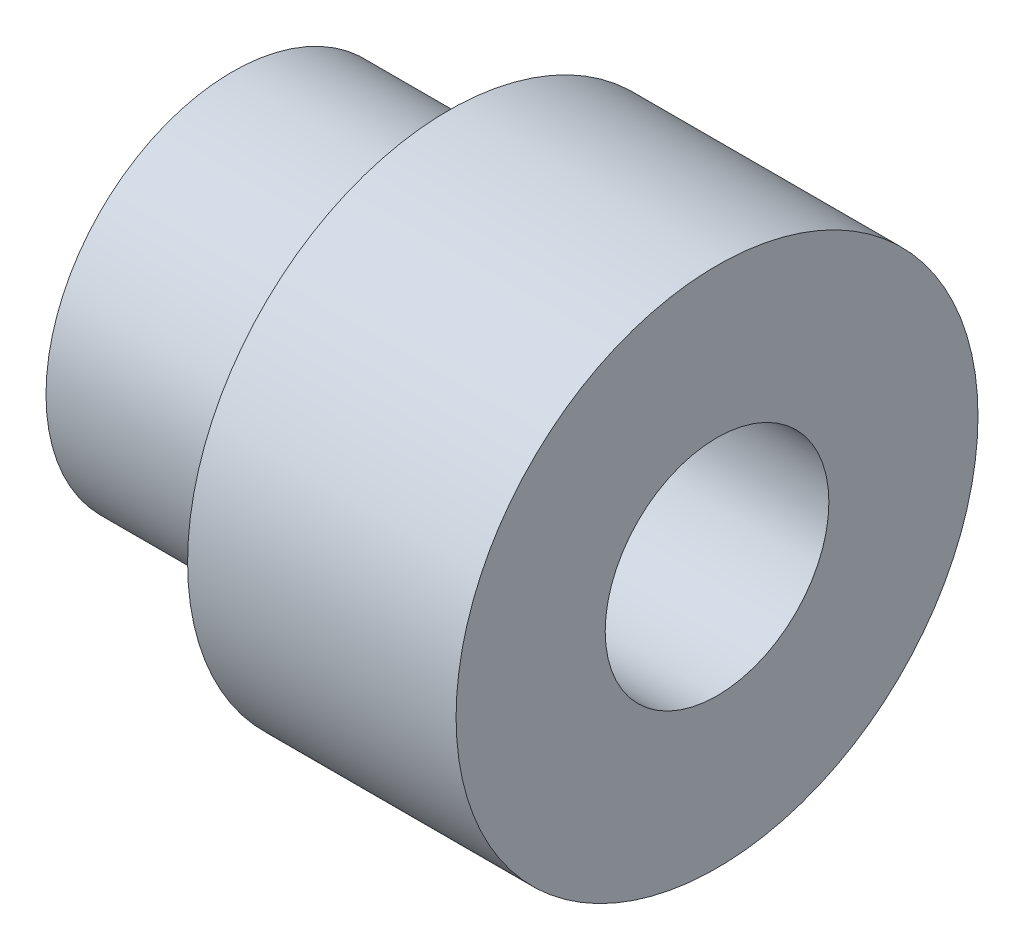
ISO-10303-21;
HEADER;
FILE_DESCRIPTION(('STEP AP214'),'2;1');
FILE_NAME('part.step','',(''),(''),'','','');
FILE_SCHEMA(('AUTOMOTIVE_DESIGN { 1 0 10303 214 1 1 1 1 }'));
ENDSEC;
DATA;
#1=APPLICATION_CONTEXT('core data for automotive mechanical design processes');
#2=APPLICATION_PROTOCOL_DEFINITION('international standard','automotive_design',2000,#1);
#3=PRODUCT_CONTEXT('',#1,'mechanical');
#4=PRODUCT('Part','Part','',(#3));
#5=PRODUCT_RELATED_PRODUCT_CATEGORY('part','',(#4));
#6=PRODUCT_DEFINITION_FORMATION('','',#4);
#7=PRODUCT_DEFINITION_CONTEXT('part definition',#1,'design');
#8=PRODUCT_DEFINITION('design','',#6,#7);
#9=PRODUCT_DEFINITION_SHAPE('','',#8);
#10=(LENGTH_UNIT() NAMED_UNIT(*) SI_UNIT(.MILLI.,.METRE.));
#11=(NAMED_UNIT(*) PLANE_ANGLE_UNIT() SI_UNIT($,.RADIAN.));
#12=(NAMED_UNIT(*) SI_UNIT($,.STERADIAN.) SOLID_ANGLE_UNIT());
#13=UNCERTAINTY_MEASURE_WITH_UNIT(LENGTH_MEASURE(1.E-05),#10,'distance_accuracy_value','');
#14=(GEOMETRIC_REPRESENTATION_CONTEXT(3) GLOBAL_UNCERTAINTY_ASSIGNED_CONTEXT((#13)) GLOBAL_UNIT_ASSIGNED_CONTEXT((#10,
#11,#12)) REPRESENTATION_CONTEXT('',''));
#15=CARTESIAN_POINT('',(0.,0.,0.));
#16=DIRECTION('',(0.,0.,1.));
#17=DIRECTION('',(1.,0.,0.));
#18=AXIS2_PLACEMENT_3D('',#15,#16,#17);
#19=CARTESIAN_POINT('',(0.,0.,0.));
#20=DIRECTION('',(1.,0.,0.));
#21=DIRECTION('',(0.,0.,-1.));
#22=AXIS2_PLACEMENT_3D('',#19,#20,#21);
#23=PLANE('',#22);
#24=CARTESIAN_POINT('',(0.,0.,0.));
#25=DIRECTION('',(1.,0.,0.));
#26=DIRECTION('',(0.,0.,-1.));
#27=AXIS2_PLACEMENT_3D('',#24,#25,#26);
#28=CIRCLE('',#27,3.);
#29=CARTESIAN_POINT('',(0.,0.,3.));
#30=VERTEX_POINT('',#29);
#31=EDGE_CURVE('E63',#30,#30,#28,.T.);
#32=ORIENTED_EDGE('',*,*,#31,.T.);
#33=EDGE_LOOP('',(#32));
#34=FACE_BOUND('',#33,.T.);
#35=CARTESIAN_POINT('',(0.,0.,0.));
#36=DIRECTION('',(-1.,0.,0.));
#37=DIRECTION('',(0.,0.,1.));
#38=AXIS2_PLACEMENT_3D('',#35,#36,#37);
#39=CIRCLE('',#38,5.);
#40=CARTESIAN_POINT('',(0.,0.,5.));
#41=VERTEX_POINT('',#40);
#42=EDGE_CURVE('E10',#41,#41,#39,.T.);
#43=ORIENTED_EDGE('',*,*,#42,.T.);
#44=EDGE_LOOP('',(#43));
#45=FACE_BOUND('',#44,.T.);
#46=ADVANCED_FACE('F39',(#34,#45),#23,.F.);
#47=CARTESIAN_POINT('',(0.,0.,0.));
#48=DIRECTION('',(-1.,0.,0.));
#49=DIRECTION('',(0.,0.,1.));
#50=AXIS2_PLACEMENT_3D('',#47,#48,#49);
#51=CYLINDRICAL_SURFACE('',#50,5.);
#52=ORIENTED_EDGE('',*,*,#42,.F.);
#53=EDGE_LOOP('',(#52));
#54=FACE_BOUND('',#53,.T.);
#55=CARTESIAN_POINT('',(5.79770114942529,0.,0.));
#56=DIRECTION('',(-1.,0.,0.));
#57=DIRECTION('',(0.,0.,1.));
#58=AXIS2_PLACEMENT_3D('',#55,#56,#57);
#59=CIRCLE('',#58,5.);
#60=CARTESIAN_POINT('',(5.79770114942529,0.,5.));
#61=VERTEX_POINT('',#60);
#62=EDGE_CURVE('E46',#61,#61,#59,.T.);
#63=ORIENTED_EDGE('',*,*,#62,.T.);
#64=EDGE_LOOP('',(#63));
#65=FACE_BOUND('',#64,.T.);
#66=ADVANCED_FACE('F88',(#54,#65),#51,.T.);
#67=CARTESIAN_POINT('',(5.79770114942529,5.,0.));
#68=DIRECTION('',(1.,0.,0.));
#69=DIRECTION('',(0.,0.,-1.));
#70=AXIS2_PLACEMENT_3D('',#67,#68,#69);
#71=PLANE('',#70);
#72=ORIENTED_EDGE('',*,*,#62,.F.);
#73=EDGE_LOOP('',(#72));
#74=FACE_BOUND('',#73,.T.);
#75=CARTESIAN_POINT('',(5.79770114942529,0.,0.));
#76=DIRECTION('',(-1.,0.,0.));
#77=DIRECTION('',(0.,0.,1.));
#78=AXIS2_PLACEMENT_3D('',#75,#76,#77);
#79=CIRCLE('',#78,7.);
#80=CARTESIAN_POINT('',(5.79770114942529,0.,7.));
#81=VERTEX_POINT('',#80);
#82=EDGE_CURVE('E51',#81,#81,#79,.T.);
#83=ORIENTED_EDGE('',*,*,#82,.T.);
#84=EDGE_LOOP('',(#83));
#85=FACE_BOUND('',#84,.T.);
#86=ADVANCED_FACE('F82',(#74,#85),#71,.F.);
#87=CARTESIAN_POINT('',(0.,0.,0.));
#88=DIRECTION('',(-1.,0.,0.));
#89=DIRECTION('',(0.,0.,1.));
#90=AXIS2_PLACEMENT_3D('',#87,#88,#89);
#91=CYLINDRICAL_SURFACE('',#90,7.);
#92=ORIENTED_EDGE('',*,*,#82,.F.);
#93=EDGE_LOOP('',(#92));
#94=FACE_BOUND('',#93,.T.);
#95=CARTESIAN_POINT('',(13.,0.,0.));
#96=DIRECTION('',(-1.,0.,0.));
#97=DIRECTION('',(0.,0.,1.));
#98=AXIS2_PLACEMENT_3D('',#95,#96,#97);
#99=CIRCLE('',#98,7.);
#100=CARTESIAN_POINT('',(13.,0.,7.));
#101=VERTEX_POINT('',#100);
#102=EDGE_CURVE('E56',#101,#101,#99,.T.);
#103=ORIENTED_EDGE('',*,*,#102,.T.);
#104=EDGE_LOOP('',(#103));
#105=FACE_BOUND('',#104,.T.);
#106=ADVANCED_FACE('F77',(#94,#105),#91,.T.);
#107=CARTESIAN_POINT('',(13.,7.,0.));
#108=DIRECTION('',(-1.,0.,0.));
#109=DIRECTION('',(0.,0.,1.));
#110=AXIS2_PLACEMENT_3D('',#107,#108,#109);
#111=PLANE('',#110);
#112=CARTESIAN_POINT('',(13.,0.,0.));
#113=DIRECTION('',(1.,0.,0.));
#114=DIRECTION('',(0.,0.,-1.));
#115=AXIS2_PLACEMENT_3D('',#112,#113,#114);
#116=CIRCLE('',#115,3.);
#117=CARTESIAN_POINT('',(13.,0.,3.));
#118=VERTEX_POINT('',#117);
#119=EDGE_CURVE('E62',#118,#118,#116,.T.);
#120=ORIENTED_EDGE('',*,*,#119,.F.);
#121=EDGE_LOOP('',(#120));
#122=FACE_BOUND('',#121,.T.);
#123=ORIENTED_EDGE('',*,*,#102,.F.);
#124=EDGE_LOOP('',(#123));
#125=FACE_BOUND('',#124,.T.);
#126=ADVANCED_FACE('F74',(#122,#125),#111,.F.);
#127=CARTESIAN_POINT('',(13.,0.,0.));
#128=DIRECTION('',(-1.,0.,0.));
#129=DIRECTION('',(0.,0.,1.));
#130=AXIS2_PLACEMENT_3D('',#127,#128,#129);
#131=CYLINDRICAL_SURFACE('',#130,3.);
#132=CARTESIAN_POINT('',(13.,0.,3.));
#133=CARTESIAN_POINT('',(12.8645833333333,0.,3.));
#134=CARTESIAN_POINT('',(12.7291666666667,0.,3.));
#135=CARTESIAN_POINT('',(12.4583333333333,0.,3.));
#136=CARTESIAN_POINT('',(12.3229166666667,0.,3.));
#137=CARTESIAN_POINT('',(12.0520833333333,0.,3.));
#138=CARTESIAN_POINT('',(11.9166666666667,0.,3.));
#139=CARTESIAN_POINT('',(11.6458333333333,0.,3.));
#140=CARTESIAN_POINT('',(11.5104166666667,0.,3.));
#141=CARTESIAN_POINT('',(11.2395833333333,0.,3.));
#142=CARTESIAN_POINT('',(11.1041666666667,0.,3.));
#143=CARTESIAN_POINT('',(10.8333333333333,0.,3.));
#144=CARTESIAN_POINT('',(10.6979166666667,0.,3.));
#145=CARTESIAN_POINT('',(10.4270833333333,0.,3.));
#146=CARTESIAN_POINT('',(10.2916666666667,0.,3.));
#147=CARTESIAN_POINT('',(10.0208333333333,0.,3.));
#148=CARTESIAN_POINT('',(9.88541666666667,0.,3.));
#149=CARTESIAN_POINT('',(9.61458333333333,0.,3.));
#150=CARTESIAN_POINT('',(9.47916666666667,0.,3.));
#151=CARTESIAN_POINT('',(9.20833333333333,0.,3.));
#152=CARTESIAN_POINT('',(9.07291666666667,0.,3.));
#153=CARTESIAN_POINT('',(8.80208333333333,0.,3.));
#154=CARTESIAN_POINT('',(8.66666666666667,0.,3.));
#155=CARTESIAN_POINT('',(8.39583333333333,0.,3.));
#156=CARTESIAN_POINT('',(8.26041666666667,0.,3.));
#157=CARTESIAN_POINT('',(7.98958333333333,0.,3.));
#158=CARTESIAN_POINT('',(7.85416666666667,0.,3.));
#159=CARTESIAN_POINT('',(7.58333333333333,0.,3.));
#160=CARTESIAN_POINT('',(7.44791666666667,0.,3.));
#161=CARTESIAN_POINT('',(7.17708333333333,0.,3.));
#162=CARTESIAN_POINT('',(7.04166666666667,0.,3.));
#163=CARTESIAN_POINT('',(6.77083333333333,0.,3.));
#164=CARTESIAN_POINT('',(6.63541666666667,0.,3.));
#165=CARTESIAN_POINT('',(6.36458333333333,0.,3.));
#166=CARTESIAN_POINT('',(6.22916666666667,0.,3.));
#167=CARTESIAN_POINT('',(5.95833333333333,0.,3.));
#168=CARTESIAN_POINT('',(5.82291666666667,0.,3.));
#169=CARTESIAN_POINT('',(5.55208333333333,0.,3.));
#170=CARTESIAN_POINT('',(5.41666666666667,0.,3.));
#171=CARTESIAN_POINT('',(5.14583333333333,0.,3.));
#172=CARTESIAN_POINT('',(5.01041666666667,0.,3.));
#173=CARTESIAN_POINT('',(4.73958333333333,0.,3.));
#174=CARTESIAN_POINT('',(4.60416666666667,0.,3.));
#175=CARTESIAN_POINT('',(4.33333333333333,0.,3.));
#176=CARTESIAN_POINT('',(4.19791666666667,0.,3.));
#177=CARTESIAN_POINT('',(3.92708333333333,0.,3.));
#178=CARTESIAN_POINT('',(3.79166666666667,0.,3.));
#179=CARTESIAN_POINT('',(3.52083333333333,0.,3.));
#180=CARTESIAN_POINT('',(3.38541666666667,0.,3.));
#181=CARTESIAN_POINT('',(3.11458333333333,0.,3.));
#182=CARTESIAN_POINT('',(2.97916666666667,0.,3.));
#183=CARTESIAN_POINT('',(2.70833333333333,0.,3.));
#184=CARTESIAN_POINT('',(2.57291666666667,0.,3.));
#185=CARTESIAN_POINT('',(2.30208333333333,0.,3.));
#186=CARTESIAN_POINT('',(2.16666666666667,0.,3.));
#187=CARTESIAN_POINT('',(1.89583333333333,0.,3.));
#188=CARTESIAN_POINT('',(1.76041666666667,0.,3.));
#189=CARTESIAN_POINT('',(1.48958333333333,0.,3.));
#190=CARTESIAN_POINT('',(1.35416666666667,0.,3.));
#191=CARTESIAN_POINT('',(1.08333333333333,0.,3.));
#192=CARTESIAN_POINT('',(0.947916666666667,0.,3.));
#193=CARTESIAN_POINT('',(0.677083333333334,0.,3.));
#194=CARTESIAN_POINT('',(0.541666666666667,0.,3.));
#195=CARTESIAN_POINT('',(0.270833333333334,0.,3.));
#196=CARTESIAN_POINT('',(0.135416666666667,0.,3.));
#197=CARTESIAN_POINT('',(0.,0.,3.));
#198=B_SPLINE_CURVE_WITH_KNOTS('',3,(#132,#133,#134,#135,#136,#137,#138,#139,#140,#141,#142,
#143,#144,#145,#146,#147,#148,#149,#150,#151,#152,#153,#154,#155,#156,#157,#158,#159,#160,#161,
#162,#163,#164,#165,#166,#167,#168,#169,#170,#171,#172,#173,#174,#175,#176,#177,#178,#179,#180,
#181,#182,#183,#184,#185,#186,#187,#188,#189,#190,#191,#192,#193,#194,#195,#196,#197),
.UNSPECIFIED.,.F.,.F.,(4,2,2,2,2,2,2,2,2,2,2,2,2,2,2,2,2,2,2,2,2,2,2,2,2,2,2,2,2,2,2,2,4),(0.,
0.406249999999999,0.812499999999999,1.21875,1.625,2.03125,2.4375,2.84375,3.25,3.65625,4.0625,
4.46875,4.875,5.28125,5.6875,6.09375,6.5,6.90625,7.3125,7.71875,8.125,8.53125,8.9375,9.34375,
9.75,10.15625,10.5625,10.96875,11.375,11.78125,12.1875,12.59375,13.),.UNSPECIFIED.);
#199=EDGE_CURVE('BSEAM71',#118,#30,#198,.T.);
#200=ORIENTED_EDGE('',*,*,#119,.T.);
#201=ORIENTED_EDGE('',*,*,#31,.F.);
#202=ORIENTED_EDGE('',*,*,#199,.T.);
#203=ORIENTED_EDGE('',*,*,#199,.F.);
#204=EDGE_LOOP('',(#200,#202,#201,#203));
#205=FACE_BOUND('',#204,.T.);
#206=ADVANCED_FACE('F71',(#205),#131,.F.);
#207=CLOSED_SHELL('',(#46,#66,#86,#106,#126,#206));
#208=MANIFOLD_SOLID_BREP('B2',#207);
#209=ADVANCED_BREP_SHAPE_REPRESENTATION('',(#18,#208),#14);
#210=SHAPE_DEFINITION_REPRESENTATION(#9,#209);
ENDSEC;
END-ISO-10303-21;
